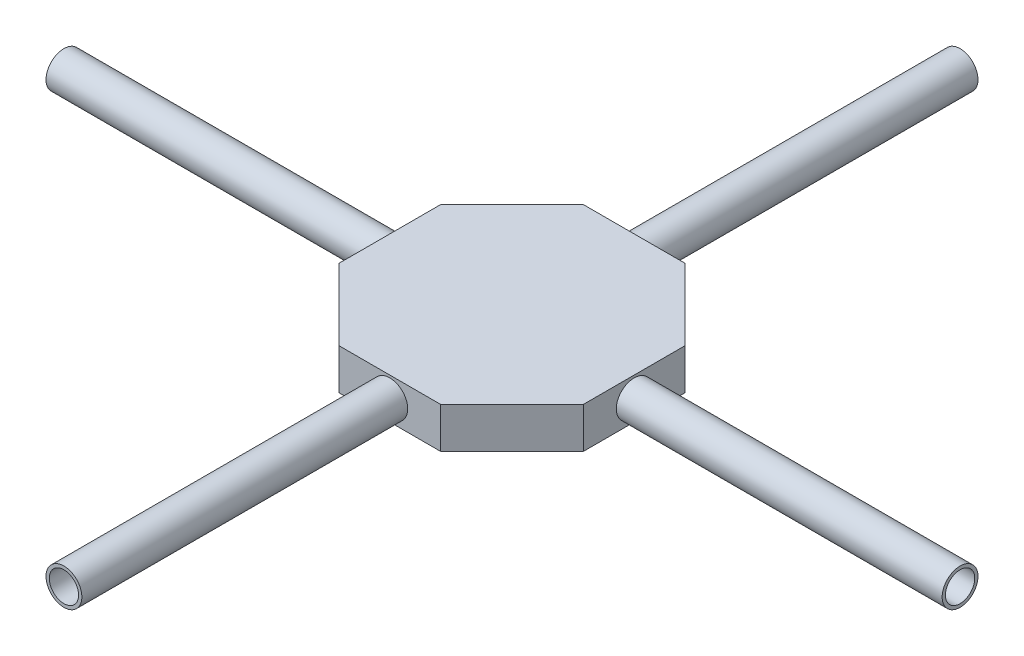
ISO-10303-21;
HEADER;
FILE_DESCRIPTION(('STEP AP214'),'2;1');
FILE_NAME('part.step','',(''),(''),'','','');
FILE_SCHEMA(('AUTOMOTIVE_DESIGN { 1 0 10303 214 1 1 1 1 }'));
ENDSEC;
DATA;
#1=APPLICATION_CONTEXT('core data for automotive mechanical design processes');
#2=APPLICATION_PROTOCOL_DEFINITION('international standard','automotive_design',2000,#1);
#3=PRODUCT_CONTEXT('',#1,'mechanical');
#4=PRODUCT('Part','Part','',(#3));
#5=PRODUCT_RELATED_PRODUCT_CATEGORY('part','',(#4));
#6=PRODUCT_DEFINITION_FORMATION('','',#4);
#7=PRODUCT_DEFINITION_CONTEXT('part definition',#1,'design');
#8=PRODUCT_DEFINITION('design','',#6,#7);
#9=PRODUCT_DEFINITION_SHAPE('','',#8);
#10=(LENGTH_UNIT() NAMED_UNIT(*) SI_UNIT(.MILLI.,.METRE.));
#11=(NAMED_UNIT(*) PLANE_ANGLE_UNIT() SI_UNIT($,.RADIAN.));
#12=(NAMED_UNIT(*) SI_UNIT($,.STERADIAN.) SOLID_ANGLE_UNIT());
#13=UNCERTAINTY_MEASURE_WITH_UNIT(LENGTH_MEASURE(1.E-05),#10,'distance_accuracy_value','');
#14=(GEOMETRIC_REPRESENTATION_CONTEXT(3) GLOBAL_UNCERTAINTY_ASSIGNED_CONTEXT((#13)) GLOBAL_UNIT_ASSIGNED_CONTEXT((#10,
#11,#12)) REPRESENTATION_CONTEXT('',''));
#15=CARTESIAN_POINT('',(0.,0.,0.));
#16=DIRECTION('',(0.,0.,1.));
#17=DIRECTION('',(1.,0.,0.));
#18=AXIS2_PLACEMENT_3D('',#15,#16,#17);
#19=CARTESIAN_POINT('',(-31.0660171779821,25.,75.));
#20=DIRECTION('',(0.,0.,-1.));
#21=DIRECTION('',(-1.,0.,0.));
#22=AXIS2_PLACEMENT_3D('',#19,#20,#21);
#23=PLANE('',#22);
#24=CARTESIAN_POINT('',(-8.07539443438316E-13,12.5000000000001,75.));
#25=DIRECTION('',(0.,0.,-1.));
#26=DIRECTION('',(-1.,0.,0.));
#27=AXIS2_PLACEMENT_3D('',#24,#25,#26);
#28=CIRCLE('',#27,11.);
#29=CARTESIAN_POINT('',(-11.0000000000008,12.5000000000001,75.));
#30=VERTEX_POINT('',#29);
#31=EDGE_CURVE('E11',#30,#30,#28,.F.);
#32=ORIENTED_EDGE('',*,*,#31,.F.);
#33=EDGE_LOOP('',(#32));
#34=FACE_BOUND('',#33,.T.);
#35=DIRECTION('',(1.,0.,0.));
#36=VECTOR('',#35,1.);
#37=CARTESIAN_POINT('',(-31.0660171779821,0.,75.));
#38=LINE('',#37,#36);
#39=CARTESIAN_POINT('',(-31.0660171779821,0.,75.));
#40=VERTEX_POINT('',#39);
#41=CARTESIAN_POINT('',(31.0660171779821,0.,75.));
#42=VERTEX_POINT('',#41);
#43=EDGE_CURVE('E130',#40,#42,#38,.T.);
#44=ORIENTED_EDGE('',*,*,#43,.T.);
#45=DIRECTION('',(0.,-1.,0.));
#46=VECTOR('',#45,1.);
#47=CARTESIAN_POINT('',(31.0660171779821,25.,75.));
#48=LINE('',#47,#46);
#49=CARTESIAN_POINT('',(31.0660171779821,25.,75.));
#50=VERTEX_POINT('',#49);
#51=EDGE_CURVE('E158',#50,#42,#48,.T.);
#52=ORIENTED_EDGE('',*,*,#51,.F.);
#53=DIRECTION('',(1.,0.,0.));
#54=VECTOR('',#53,1.);
#55=CARTESIAN_POINT('',(-31.0660171779821,25.,75.));
#56=LINE('',#55,#54);
#57=CARTESIAN_POINT('',(-31.0660171779821,25.,75.));
#58=VERTEX_POINT('',#57);
#59=EDGE_CURVE('E145',#58,#50,#56,.T.);
#60=ORIENTED_EDGE('',*,*,#59,.F.);
#61=DIRECTION('',(0.,-1.,0.));
#62=VECTOR('',#61,1.);
#63=CARTESIAN_POINT('',(-31.0660171779821,25.,75.));
#64=LINE('',#63,#62);
#65=EDGE_CURVE('E126',#58,#40,#64,.T.);
#66=ORIENTED_EDGE('',*,*,#65,.T.);
#67=EDGE_LOOP('',(#44,#52,#60,#66));
#68=FACE_BOUND('',#67,.T.);
#69=ADVANCED_FACE('F33',(#34,#68),#23,.F.);
#70=CARTESIAN_POINT('',(31.0660171779821,25.,75.));
#71=DIRECTION('',(-0.707106781186547,0.,-0.707106781186547));
#72=DIRECTION('',(-0.707106781186548,0.,0.707106781186547));
#73=AXIS2_PLACEMENT_3D('',#70,#71,#72);
#74=PLANE('',#73);
#75=DIRECTION('',(0.707106781186547,0.,-0.707106781186547));
#76=VECTOR('',#75,1.);
#77=CARTESIAN_POINT('',(31.0660171779821,0.,75.));
#78=LINE('',#77,#76);
#79=CARTESIAN_POINT('',(75.,0.,31.0660171779821));
#80=VERTEX_POINT('',#79);
#81=EDGE_CURVE('E133',#42,#80,#78,.T.);
#82=ORIENTED_EDGE('',*,*,#81,.T.);
#83=DIRECTION('',(0.,-1.,0.));
#84=VECTOR('',#83,1.);
#85=CARTESIAN_POINT('',(75.,25.,31.0660171779821));
#86=LINE('',#85,#84);
#87=CARTESIAN_POINT('',(75.,25.,31.0660171779821));
#88=VERTEX_POINT('',#87);
#89=EDGE_CURVE('E155',#88,#80,#86,.T.);
#90=ORIENTED_EDGE('',*,*,#89,.F.);
#91=DIRECTION('',(0.707106781186547,0.,-0.707106781186547));
#92=VECTOR('',#91,1.);
#93=CARTESIAN_POINT('',(31.0660171779821,25.,75.));
#94=LINE('',#93,#92);
#95=EDGE_CURVE('E93',#50,#88,#94,.T.);
#96=ORIENTED_EDGE('',*,*,#95,.F.);
#97=ORIENTED_EDGE('',*,*,#51,.T.);
#98=EDGE_LOOP('',(#82,#90,#96,#97));
#99=FACE_BOUND('',#98,.T.);
#100=ADVANCED_FACE('F174',(#99),#74,.F.);
#101=CARTESIAN_POINT('',(75.,25.,31.0660171779821));
#102=DIRECTION('',(-1.,0.,0.));
#103=DIRECTION('',(0.,0.,1.));
#104=AXIS2_PLACEMENT_3D('',#101,#102,#103);
#105=PLANE('',#104);
#106=CARTESIAN_POINT('',(75.,12.5,0.));
#107=DIRECTION('',(-1.,0.,0.));
#108=DIRECTION('',(0.,0.,1.));
#109=AXIS2_PLACEMENT_3D('',#106,#107,#108);
#110=CIRCLE('',#109,11.);
#111=CARTESIAN_POINT('',(75.,12.5,11.));
#112=VERTEX_POINT('',#111);
#113=EDGE_CURVE('E41',#112,#112,#110,.F.);
#114=ORIENTED_EDGE('',*,*,#113,.F.);
#115=EDGE_LOOP('',(#114));
#116=FACE_BOUND('',#115,.T.);
#117=DIRECTION('',(0.,0.,-1.));
#118=VECTOR('',#117,1.);
#119=CARTESIAN_POINT('',(75.,0.,31.0660171779821));
#120=LINE('',#119,#118);
#121=CARTESIAN_POINT('',(75.,0.,-31.0660171779822));
#122=VERTEX_POINT('',#121);
#123=EDGE_CURVE('E136',#80,#122,#120,.T.);
#124=ORIENTED_EDGE('',*,*,#123,.T.);
#125=DIRECTION('',(0.,-1.,0.));
#126=VECTOR('',#125,1.);
#127=CARTESIAN_POINT('',(75.,25.,-31.0660171779822));
#128=LINE('',#127,#126);
#129=CARTESIAN_POINT('',(75.,25.,-31.0660171779822));
#130=VERTEX_POINT('',#129);
#131=EDGE_CURVE('E152',#130,#122,#128,.T.);
#132=ORIENTED_EDGE('',*,*,#131,.F.);
#133=DIRECTION('',(0.,0.,-1.));
#134=VECTOR('',#133,1.);
#135=CARTESIAN_POINT('',(75.,25.,31.0660171779821));
#136=LINE('',#135,#134);
#137=EDGE_CURVE('E191',#88,#130,#136,.T.);
#138=ORIENTED_EDGE('',*,*,#137,.F.);
#139=ORIENTED_EDGE('',*,*,#89,.T.);
#140=EDGE_LOOP('',(#124,#132,#138,#139));
#141=FACE_BOUND('',#140,.T.);
#142=ADVANCED_FACE('F170',(#116,#141),#105,.F.);
#143=CARTESIAN_POINT('',(75.,25.,-31.0660171779822));
#144=DIRECTION('',(-0.707106781186547,0.,0.707106781186548));
#145=DIRECTION('',(0.707106781186548,0.,0.707106781186547));
#146=AXIS2_PLACEMENT_3D('',#143,#144,#145);
#147=PLANE('',#146);
#148=DIRECTION('',(-0.707106781186548,0.,-0.707106781186547));
#149=VECTOR('',#148,1.);
#150=CARTESIAN_POINT('',(75.,0.,-31.0660171779822));
#151=LINE('',#150,#149);
#152=CARTESIAN_POINT('',(31.0660171779822,0.,-75.));
#153=VERTEX_POINT('',#152);
#154=EDGE_CURVE('E138',#122,#153,#151,.T.);
#155=ORIENTED_EDGE('',*,*,#154,.T.);
#156=DIRECTION('',(0.,-1.,0.));
#157=VECTOR('',#156,1.);
#158=CARTESIAN_POINT('',(31.0660171779822,25.,-75.));
#159=LINE('',#158,#157);
#160=CARTESIAN_POINT('',(31.0660171779822,25.,-75.));
#161=VERTEX_POINT('',#160);
#162=EDGE_CURVE('E149',#161,#153,#159,.T.);
#163=ORIENTED_EDGE('',*,*,#162,.F.);
#164=DIRECTION('',(-0.707106781186548,0.,-0.707106781186547));
#165=VECTOR('',#164,1.);
#166=CARTESIAN_POINT('',(75.,25.,-31.0660171779822));
#167=LINE('',#166,#165);
#168=EDGE_CURVE('E185',#130,#161,#167,.T.);
#169=ORIENTED_EDGE('',*,*,#168,.F.);
#170=ORIENTED_EDGE('',*,*,#131,.T.);
#171=EDGE_LOOP('',(#155,#163,#169,#170));
#172=FACE_BOUND('',#171,.T.);
#173=ADVANCED_FACE('F173',(#172),#147,.F.);
#174=CARTESIAN_POINT('',(31.0660171779822,25.,-75.));
#175=DIRECTION('',(0.,0.,1.));
#176=DIRECTION('',(1.,0.,0.));
#177=AXIS2_PLACEMENT_3D('',#174,#175,#176);
#178=PLANE('',#177);
#179=CARTESIAN_POINT('',(2.83817242611846E-13,12.4999999999999,-75.));
#180=DIRECTION('',(0.,0.,1.));
#181=DIRECTION('',(1.,0.,0.));
#182=AXIS2_PLACEMENT_3D('',#179,#180,#181);
#183=CIRCLE('',#182,11.);
#184=CARTESIAN_POINT('',(11.0000000000003,12.4999999999999,-75.));
#185=VERTEX_POINT('',#184);
#186=EDGE_CURVE('E163',#185,#185,#183,.F.);
#187=ORIENTED_EDGE('',*,*,#186,.F.);
#188=EDGE_LOOP('',(#187));
#189=FACE_BOUND('',#188,.T.);
#190=DIRECTION('',(-1.,0.,0.));
#191=VECTOR('',#190,1.);
#192=CARTESIAN_POINT('',(31.0660171779822,0.,-75.));
#193=LINE('',#192,#191);
#194=CARTESIAN_POINT('',(-31.0660171779821,0.,-75.));
#195=VERTEX_POINT('',#194);
#196=EDGE_CURVE('E140',#153,#195,#193,.T.);
#197=ORIENTED_EDGE('',*,*,#196,.T.);
#198=DIRECTION('',(0.,-1.,0.));
#199=VECTOR('',#198,1.);
#200=CARTESIAN_POINT('',(-31.0660171779821,25.,-75.));
#201=LINE('',#200,#199);
#202=CARTESIAN_POINT('',(-31.0660171779821,25.,-75.));
#203=VERTEX_POINT('',#202);
#204=EDGE_CURVE('E121',#203,#195,#201,.T.);
#205=ORIENTED_EDGE('',*,*,#204,.F.);
#206=DIRECTION('',(-1.,0.,0.));
#207=VECTOR('',#206,1.);
#208=CARTESIAN_POINT('',(31.0660171779822,25.,-75.));
#209=LINE('',#208,#207);
#210=EDGE_CURVE('E112',#161,#203,#209,.T.);
#211=ORIENTED_EDGE('',*,*,#210,.F.);
#212=ORIENTED_EDGE('',*,*,#162,.T.);
#213=EDGE_LOOP('',(#197,#205,#211,#212));
#214=FACE_BOUND('',#213,.T.);
#215=ADVANCED_FACE('F190',(#189,#214),#178,.F.);
#216=CARTESIAN_POINT('',(-31.0660171779821,25.,-75.));
#217=DIRECTION('',(0.707106781186547,0.,0.707106781186548));
#218=DIRECTION('',(0.707106781186548,0.,-0.707106781186547));
#219=AXIS2_PLACEMENT_3D('',#216,#217,#218);
#220=PLANE('',#219);
#221=DIRECTION('',(-0.707106781186548,0.,0.707106781186547));
#222=VECTOR('',#221,1.);
#223=CARTESIAN_POINT('',(-31.0660171779821,0.,-75.));
#224=LINE('',#223,#222);
#225=CARTESIAN_POINT('',(-75.,0.,-31.0660171779821));
#226=VERTEX_POINT('',#225);
#227=EDGE_CURVE('E120',#195,#226,#224,.T.);
#228=ORIENTED_EDGE('',*,*,#227,.T.);
#229=DIRECTION('',(0.,-1.,0.));
#230=VECTOR('',#229,1.);
#231=CARTESIAN_POINT('',(-75.,25.,-31.0660171779821));
#232=LINE('',#231,#230);
#233=CARTESIAN_POINT('',(-75.,25.,-31.0660171779821));
#234=VERTEX_POINT('',#233);
#235=EDGE_CURVE('E117',#234,#226,#232,.T.);
#236=ORIENTED_EDGE('',*,*,#235,.F.);
#237=DIRECTION('',(-0.707106781186548,0.,0.707106781186547));
#238=VECTOR('',#237,1.);
#239=CARTESIAN_POINT('',(-31.0660171779821,25.,-75.));
#240=LINE('',#239,#238);
#241=EDGE_CURVE('E106',#203,#234,#240,.T.);
#242=ORIENTED_EDGE('',*,*,#241,.F.);
#243=ORIENTED_EDGE('',*,*,#204,.T.);
#244=EDGE_LOOP('',(#228,#236,#242,#243));
#245=FACE_BOUND('',#244,.T.);
#246=ADVANCED_FACE('F118',(#245),#220,.F.);
#247=CARTESIAN_POINT('',(-75.,25.,-31.0660171779821));
#248=DIRECTION('',(1.,0.,0.));
#249=DIRECTION('',(0.,0.,-1.));
#250=AXIS2_PLACEMENT_3D('',#247,#248,#249);
#251=PLANE('',#250);
#252=CARTESIAN_POINT('',(-75.,12.5,0.));
#253=DIRECTION('',(1.,0.,0.));
#254=DIRECTION('',(0.,0.,-1.));
#255=AXIS2_PLACEMENT_3D('',#252,#253,#254);
#256=CIRCLE('',#255,11.);
#257=CARTESIAN_POINT('',(-75.,12.5,-11.));
#258=VERTEX_POINT('',#257);
#259=EDGE_CURVE('E160',#258,#258,#256,.F.);
#260=ORIENTED_EDGE('',*,*,#259,.F.);
#261=EDGE_LOOP('',(#260));
#262=FACE_BOUND('',#261,.T.);
#263=DIRECTION('',(0.,0.,1.));
#264=VECTOR('',#263,1.);
#265=CARTESIAN_POINT('',(-75.,0.,-31.0660171779821));
#266=LINE('',#265,#264);
#267=CARTESIAN_POINT('',(-75.,0.,31.0660171779821));
#268=VERTEX_POINT('',#267);
#269=EDGE_CURVE('E78',#226,#268,#266,.T.);
#270=ORIENTED_EDGE('',*,*,#269,.T.);
#271=DIRECTION('',(0.,-1.,0.));
#272=VECTOR('',#271,1.);
#273=CARTESIAN_POINT('',(-75.,25.,31.0660171779821));
#274=LINE('',#273,#272);
#275=CARTESIAN_POINT('',(-75.,25.,31.0660171779821));
#276=VERTEX_POINT('',#275);
#277=EDGE_CURVE('E122',#276,#268,#274,.T.);
#278=ORIENTED_EDGE('',*,*,#277,.F.);
#279=DIRECTION('',(0.,0.,1.));
#280=VECTOR('',#279,1.);
#281=CARTESIAN_POINT('',(-75.,25.,-31.0660171779821));
#282=LINE('',#281,#280);
#283=EDGE_CURVE('E110',#234,#276,#282,.T.);
#284=ORIENTED_EDGE('',*,*,#283,.F.);
#285=ORIENTED_EDGE('',*,*,#235,.T.);
#286=EDGE_LOOP('',(#270,#278,#284,#285));
#287=FACE_BOUND('',#286,.T.);
#288=ADVANCED_FACE('F124',(#262,#287),#251,.F.);
#289=CARTESIAN_POINT('',(-75.,25.,31.0660171779821));
#290=DIRECTION('',(0.707106781186548,0.,-0.707106781186547));
#291=DIRECTION('',(-0.707106781186547,0.,-0.707106781186548));
#292=AXIS2_PLACEMENT_3D('',#289,#290,#291);
#293=PLANE('',#292);
#294=DIRECTION('',(0.707106781186547,0.,0.707106781186548));
#295=VECTOR('',#294,1.);
#296=CARTESIAN_POINT('',(-75.,0.,31.0660171779821));
#297=LINE('',#296,#295);
#298=EDGE_CURVE('E84',#268,#40,#297,.T.);
#299=ORIENTED_EDGE('',*,*,#298,.T.);
#300=ORIENTED_EDGE('',*,*,#65,.F.);
#301=DIRECTION('',(0.707106781186547,0.,0.707106781186548));
#302=VECTOR('',#301,1.);
#303=CARTESIAN_POINT('',(-75.,25.,31.0660171779821));
#304=LINE('',#303,#302);
#305=EDGE_CURVE('E49',#276,#58,#304,.T.);
#306=ORIENTED_EDGE('',*,*,#305,.F.);
#307=ORIENTED_EDGE('',*,*,#277,.T.);
#308=EDGE_LOOP('',(#299,#300,#306,#307));
#309=FACE_BOUND('',#308,.T.);
#310=ADVANCED_FACE('F423',(#309),#293,.F.);
#311=CARTESIAN_POINT('',(0.,25.,0.));
#312=DIRECTION('',(0.,1.,0.));
#313=DIRECTION('',(0.,0.,1.));
#314=AXIS2_PLACEMENT_3D('',#311,#312,#313);
#315=PLANE('',#314);
#316=ORIENTED_EDGE('',*,*,#59,.T.);
#317=ORIENTED_EDGE('',*,*,#95,.T.);
#318=ORIENTED_EDGE('',*,*,#137,.T.);
#319=ORIENTED_EDGE('',*,*,#168,.T.);
#320=ORIENTED_EDGE('',*,*,#210,.T.);
#321=ORIENTED_EDGE('',*,*,#241,.T.);
#322=ORIENTED_EDGE('',*,*,#283,.T.);
#323=ORIENTED_EDGE('',*,*,#305,.T.);
#324=EDGE_LOOP('',(#316,#317,#318,#319,#320,#321,#322,#323));
#325=FACE_BOUND('',#324,.T.);
#326=ADVANCED_FACE('F108',(#325),#315,.T.);
#327=CARTESIAN_POINT('',(0.,0.,0.));
#328=DIRECTION('',(0.,1.,0.));
#329=DIRECTION('',(0.,0.,1.));
#330=AXIS2_PLACEMENT_3D('',#327,#328,#329);
#331=PLANE('',#330);
#332=ORIENTED_EDGE('',*,*,#43,.F.);
#333=ORIENTED_EDGE('',*,*,#298,.F.);
#334=ORIENTED_EDGE('',*,*,#269,.F.);
#335=ORIENTED_EDGE('',*,*,#227,.F.);
#336=ORIENTED_EDGE('',*,*,#196,.F.);
#337=ORIENTED_EDGE('',*,*,#154,.F.);
#338=ORIENTED_EDGE('',*,*,#123,.F.);
#339=ORIENTED_EDGE('',*,*,#81,.F.);
#340=EDGE_LOOP('',(#332,#333,#334,#335,#336,#337,#338,#339));
#341=FACE_BOUND('',#340,.T.);
#342=ADVANCED_FACE('F188',(#341),#331,.F.);
#343=CARTESIAN_POINT('',(-275.,12.5,0.));
#344=DIRECTION('',(-1.,0.,0.));
#345=DIRECTION('',(0.,0.,1.));
#346=AXIS2_PLACEMENT_3D('',#343,#344,#345);
#347=PLANE('',#346);
#348=CARTESIAN_POINT('',(-275.,12.5,0.));
#349=DIRECTION('',(-1.,0.,0.));
#350=DIRECTION('',(0.,0.,1.));
#351=AXIS2_PLACEMENT_3D('',#348,#349,#350);
#352=CIRCLE('',#351,11.);
#353=CARTESIAN_POINT('',(-275.,12.5,10.9999999999999));
#354=VERTEX_POINT('',#353);
#355=EDGE_CURVE('E134',#354,#354,#352,.T.);
#356=ORIENTED_EDGE('',*,*,#355,.T.);
#357=EDGE_LOOP('',(#356));
#358=FACE_BOUND('',#357,.T.);
#359=CARTESIAN_POINT('',(-275.,12.5,0.));
#360=DIRECTION('',(-1.,0.,0.));
#361=DIRECTION('',(0.,0.,1.));
#362=AXIS2_PLACEMENT_3D('',#359,#360,#361);
#363=CIRCLE('',#362,9.);
#364=CARTESIAN_POINT('',(-275.,12.5,8.99999999999993));
#365=VERTEX_POINT('',#364);
#366=EDGE_CURVE('E199',#365,#365,#363,.T.);
#367=ORIENTED_EDGE('',*,*,#366,.F.);
#368=EDGE_LOOP('',(#367));
#369=FACE_BOUND('',#368,.T.);
#370=ADVANCED_FACE('F404',(#358,#369),#347,.T.);
#371=CARTESIAN_POINT('',(-275.,12.5,0.));
#372=DIRECTION('',(1.,0.,0.));
#373=DIRECTION('',(0.,0.,-1.));
#374=AXIS2_PLACEMENT_3D('',#371,#372,#373);
#375=CYLINDRICAL_SURFACE('',#374,11.);
#376=ORIENTED_EDGE('',*,*,#355,.F.);
#377=EDGE_LOOP('',(#376));
#378=FACE_BOUND('',#377,.T.);
#379=ORIENTED_EDGE('',*,*,#259,.T.);
#380=EDGE_LOOP('',(#379));
#381=FACE_BOUND('',#380,.T.);
#382=ADVANCED_FACE('F394',(#378,#381),#375,.T.);
#383=CARTESIAN_POINT('',(-275.,12.5,0.));
#384=DIRECTION('',(1.,0.,0.));
#385=DIRECTION('',(0.,0.,-1.));
#386=AXIS2_PLACEMENT_3D('',#383,#384,#385);
#387=CYLINDRICAL_SURFACE('',#386,9.);
#388=ORIENTED_EDGE('',*,*,#366,.T.);
#389=EDGE_LOOP('',(#388));
#390=FACE_BOUND('',#389,.T.);
#391=CARTESIAN_POINT('',(-75.,12.5,0.));
#392=DIRECTION('',(-1.,0.,0.));
#393=DIRECTION('',(0.,0.,1.));
#394=AXIS2_PLACEMENT_3D('',#391,#392,#393);
#395=CIRCLE('',#394,9.);
#396=CARTESIAN_POINT('',(-75.,12.5,8.99999999999997));
#397=VERTEX_POINT('',#396);
#398=EDGE_CURVE('E200',#397,#397,#395,.T.);
#399=ORIENTED_EDGE('',*,*,#398,.F.);
#400=EDGE_LOOP('',(#399));
#401=FACE_BOUND('',#400,.T.);
#402=ADVANCED_FACE('F383',(#390,#401),#387,.F.);
#403=ORIENTED_EDGE('',*,*,#398,.T.);
#404=EDGE_LOOP('',(#403));
#405=FACE_BOUND('',#404,.T.);
#406=ADVANCED_FACE('F350',(#405),#251,.F.);
#407=CARTESIAN_POINT('',(1.02678543510229E-12,12.4999999999998,-275.));
#408=DIRECTION('',(0.,0.,-1.));
#409=DIRECTION('',(-1.,0.,0.));
#410=AXIS2_PLACEMENT_3D('',#407,#408,#409);
#411=PLANE('',#410);
#412=CARTESIAN_POINT('',(1.02678543510229E-12,12.4999999999998,-275.));
#413=DIRECTION('',(0.,0.,-1.));
#414=DIRECTION('',(-1.,0.,0.));
#415=AXIS2_PLACEMENT_3D('',#412,#413,#414);
#416=CIRCLE('',#415,11.);
#417=CARTESIAN_POINT('',(-10.999999999999,12.4999999999998,-275.));
#418=VERTEX_POINT('',#417);
#419=EDGE_CURVE('E203',#418,#418,#416,.T.);
#420=ORIENTED_EDGE('',*,*,#419,.T.);
#421=EDGE_LOOP('',(#420));
#422=FACE_BOUND('',#421,.T.);
#423=CARTESIAN_POINT('',(1.02678543510229E-12,12.4999999999998,-275.));
#424=DIRECTION('',(0.,0.,-1.));
#425=DIRECTION('',(-1.,0.,0.));
#426=AXIS2_PLACEMENT_3D('',#423,#424,#425);
#427=CIRCLE('',#426,9.);
#428=CARTESIAN_POINT('',(-8.99999999999897,12.4999999999998,-275.));
#429=VERTEX_POINT('',#428);
#430=EDGE_CURVE('E208',#429,#429,#427,.T.);
#431=ORIENTED_EDGE('',*,*,#430,.F.);
#432=EDGE_LOOP('',(#431));
#433=FACE_BOUND('',#432,.T.);
#434=ADVANCED_FACE('F340',(#422,#433),#411,.T.);
#435=CARTESIAN_POINT('',(1.02678543510229E-12,12.4999999999998,-275.));
#436=DIRECTION('',(0.,0.,1.));
#437=DIRECTION('',(1.,0.,0.));
#438=AXIS2_PLACEMENT_3D('',#435,#436,#437);
#439=CYLINDRICAL_SURFACE('',#438,11.);
#440=ORIENTED_EDGE('',*,*,#419,.F.);
#441=EDGE_LOOP('',(#440));
#442=FACE_BOUND('',#441,.T.);
#443=ORIENTED_EDGE('',*,*,#186,.T.);
#444=EDGE_LOOP('',(#443));
#445=FACE_BOUND('',#444,.T.);
#446=ADVANCED_FACE('F330',(#442,#445),#439,.T.);
#447=CARTESIAN_POINT('',(1.02678543510229E-12,12.4999999999998,-275.));
#448=DIRECTION('',(0.,0.,1.));
#449=DIRECTION('',(1.,0.,0.));
#450=AXIS2_PLACEMENT_3D('',#447,#448,#449);
#451=CYLINDRICAL_SURFACE('',#450,9.);
#452=ORIENTED_EDGE('',*,*,#430,.T.);
#453=EDGE_LOOP('',(#452));
#454=FACE_BOUND('',#453,.T.);
#455=CARTESIAN_POINT('',(2.83817242611846E-13,12.4999999999999,-75.));
#456=DIRECTION('',(0.,0.,-1.));
#457=DIRECTION('',(-1.,0.,0.));
#458=AXIS2_PLACEMENT_3D('',#455,#456,#457);
#459=CIRCLE('',#458,9.);
#460=CARTESIAN_POINT('',(-8.99999999999971,12.4999999999999,-75.));
#461=VERTEX_POINT('',#460);
#462=EDGE_CURVE('E209',#461,#461,#459,.T.);
#463=ORIENTED_EDGE('',*,*,#462,.F.);
#464=EDGE_LOOP('',(#463));
#465=FACE_BOUND('',#464,.T.);
#466=ADVANCED_FACE('F320',(#454,#465),#451,.F.);
#467=ORIENTED_EDGE('',*,*,#462,.T.);
#468=EDGE_LOOP('',(#467));
#469=FACE_BOUND('',#468,.T.);
#470=ADVANCED_FACE('F310',(#469),#178,.F.);
#471=CARTESIAN_POINT('',(275.,12.5,0.));
#472=DIRECTION('',(1.,0.,0.));
#473=DIRECTION('',(0.,0.,-1.));
#474=AXIS2_PLACEMENT_3D('',#471,#472,#473);
#475=PLANE('',#474);
#476=CARTESIAN_POINT('',(275.,12.5,0.));
#477=DIRECTION('',(1.,0.,0.));
#478=DIRECTION('',(0.,0.,-1.));
#479=AXIS2_PLACEMENT_3D('',#476,#477,#478);
#480=CIRCLE('',#479,11.);
#481=CARTESIAN_POINT('',(275.,12.5,-10.9999999999999));
#482=VERTEX_POINT('',#481);
#483=EDGE_CURVE('E212',#482,#482,#480,.T.);
#484=ORIENTED_EDGE('',*,*,#483,.T.);
#485=EDGE_LOOP('',(#484));
#486=FACE_BOUND('',#485,.T.);
#487=CARTESIAN_POINT('',(275.,12.5,0.));
#488=DIRECTION('',(1.,0.,0.));
#489=DIRECTION('',(0.,0.,-1.));
#490=AXIS2_PLACEMENT_3D('',#487,#488,#489);
#491=CIRCLE('',#490,9.);
#492=CARTESIAN_POINT('',(275.,12.5,-8.99999999999994));
#493=VERTEX_POINT('',#492);
#494=EDGE_CURVE('E217',#493,#493,#491,.T.);
#495=ORIENTED_EDGE('',*,*,#494,.F.);
#496=EDGE_LOOP('',(#495));
#497=FACE_BOUND('',#496,.T.);
#498=ADVANCED_FACE('F300',(#486,#497),#475,.T.);
#499=CARTESIAN_POINT('',(275.,12.5,0.));
#500=DIRECTION('',(-1.,0.,0.));
#501=DIRECTION('',(0.,0.,1.));
#502=AXIS2_PLACEMENT_3D('',#499,#500,#501);
#503=CYLINDRICAL_SURFACE('',#502,11.);
#504=ORIENTED_EDGE('',*,*,#483,.F.);
#505=EDGE_LOOP('',(#504));
#506=FACE_BOUND('',#505,.T.);
#507=ORIENTED_EDGE('',*,*,#113,.T.);
#508=EDGE_LOOP('',(#507));
#509=FACE_BOUND('',#508,.T.);
#510=ADVANCED_FACE('F168',(#506,#509),#503,.T.);
#511=CARTESIAN_POINT('',(275.,12.5,0.));
#512=DIRECTION('',(-1.,0.,0.));
#513=DIRECTION('',(0.,0.,1.));
#514=AXIS2_PLACEMENT_3D('',#511,#512,#513);
#515=CYLINDRICAL_SURFACE('',#514,9.);
#516=ORIENTED_EDGE('',*,*,#494,.T.);
#517=EDGE_LOOP('',(#516));
#518=FACE_BOUND('',#517,.T.);
#519=CARTESIAN_POINT('',(75.,12.5,0.));
#520=DIRECTION('',(1.,0.,0.));
#521=DIRECTION('',(0.,0.,-1.));
#522=AXIS2_PLACEMENT_3D('',#519,#520,#521);
#523=CIRCLE('',#522,9.);
#524=CARTESIAN_POINT('',(75.,12.5,-8.99999999999999));
#525=VERTEX_POINT('',#524);
#526=EDGE_CURVE('E218',#525,#525,#523,.T.);
#527=ORIENTED_EDGE('',*,*,#526,.F.);
#528=EDGE_LOOP('',(#527));
#529=FACE_BOUND('',#528,.T.);
#530=ADVANCED_FACE('F247',(#518,#529),#515,.F.);
#531=ORIENTED_EDGE('',*,*,#526,.T.);
#532=EDGE_LOOP('',(#531));
#533=FACE_BOUND('',#532,.T.);
#534=ADVANCED_FACE('F176',(#533),#105,.F.);
#535=CARTESIAN_POINT('',(-2.94710017146601E-12,12.5000000000002,275.));
#536=DIRECTION('',(0.,0.,1.));
#537=DIRECTION('',(1.,0.,0.));
#538=AXIS2_PLACEMENT_3D('',#535,#536,#537);
#539=PLANE('',#538);
#540=CARTESIAN_POINT('',(-2.94710017146601E-12,12.5000000000002,275.));
#541=DIRECTION('',(0.,0.,1.));
#542=DIRECTION('',(1.,0.,0.));
#543=AXIS2_PLACEMENT_3D('',#540,#541,#542);
#544=CIRCLE('',#543,11.);
#545=CARTESIAN_POINT('',(10.9999999999971,12.5000000000002,275.));
#546=VERTEX_POINT('',#545);
#547=EDGE_CURVE('E221',#546,#546,#544,.T.);
#548=ORIENTED_EDGE('',*,*,#547,.T.);
#549=EDGE_LOOP('',(#548));
#550=FACE_BOUND('',#549,.T.);
#551=CARTESIAN_POINT('',(-2.94710017146601E-12,12.5000000000002,275.));
#552=DIRECTION('',(0.,0.,1.));
#553=DIRECTION('',(1.,0.,0.));
#554=AXIS2_PLACEMENT_3D('',#551,#552,#553);
#555=CIRCLE('',#554,9.);
#556=CARTESIAN_POINT('',(8.99999999999705,12.5000000000002,275.));
#557=VERTEX_POINT('',#556);
#558=EDGE_CURVE('E226',#557,#557,#555,.T.);
#559=ORIENTED_EDGE('',*,*,#558,.F.);
#560=EDGE_LOOP('',(#559));
#561=FACE_BOUND('',#560,.T.);
#562=ADVANCED_FACE('F236',(#550,#561),#539,.T.);
#563=CARTESIAN_POINT('',(-2.94710017146601E-12,12.5000000000002,275.));
#564=DIRECTION('',(0.,0.,-1.));
#565=DIRECTION('',(-1.,0.,0.));
#566=AXIS2_PLACEMENT_3D('',#563,#564,#565);
#567=CYLINDRICAL_SURFACE('',#566,11.);
#568=ORIENTED_EDGE('',*,*,#547,.F.);
#569=EDGE_LOOP('',(#568));
#570=FACE_BOUND('',#569,.T.);
#571=ORIENTED_EDGE('',*,*,#31,.T.);
#572=EDGE_LOOP('',(#571));
#573=FACE_BOUND('',#572,.T.);
#574=ADVANCED_FACE('F238',(#570,#573),#567,.T.);
#575=CARTESIAN_POINT('',(-2.94710017146601E-12,12.5000000000002,275.));
#576=DIRECTION('',(0.,0.,-1.));
#577=DIRECTION('',(-1.,0.,0.));
#578=AXIS2_PLACEMENT_3D('',#575,#576,#577);
#579=CYLINDRICAL_SURFACE('',#578,9.);
#580=ORIENTED_EDGE('',*,*,#558,.T.);
#581=EDGE_LOOP('',(#580));
#582=FACE_BOUND('',#581,.T.);
#583=CARTESIAN_POINT('',(-8.07539443438316E-13,12.5000000000001,75.));
#584=DIRECTION('',(0.,0.,1.));
#585=DIRECTION('',(1.,0.,0.));
#586=AXIS2_PLACEMENT_3D('',#583,#584,#585);
#587=CIRCLE('',#586,9.);
#588=CARTESIAN_POINT('',(8.99999999999919,12.5,75.0000000000001));
#589=VERTEX_POINT('',#588);
#590=EDGE_CURVE('E227',#589,#589,#587,.T.);
#591=ORIENTED_EDGE('',*,*,#590,.F.);
#592=EDGE_LOOP('',(#591));
#593=FACE_BOUND('',#592,.T.);
#594=ADVANCED_FACE('F233',(#582,#593),#579,.F.);
#595=ORIENTED_EDGE('',*,*,#590,.T.);
#596=EDGE_LOOP('',(#595));
#597=FACE_BOUND('',#596,.T.);
#598=ADVANCED_FACE('F252',(#597),#23,.F.);
#599=CLOSED_SHELL('',(#69,#100,#142,#173,#215,#246,#288,#310,#326,#342,#370,#382,#402,#406,#434,
#446,#466,#470,#498,#510,#530,#534,#562,#574,#594,#598));
#600=MANIFOLD_SOLID_BREP('B2',#599);
#601=ADVANCED_BREP_SHAPE_REPRESENTATION('',(#18,#600),#14);
#602=SHAPE_DEFINITION_REPRESENTATION(#9,#601);
ENDSEC;
END-ISO-10303-21;
